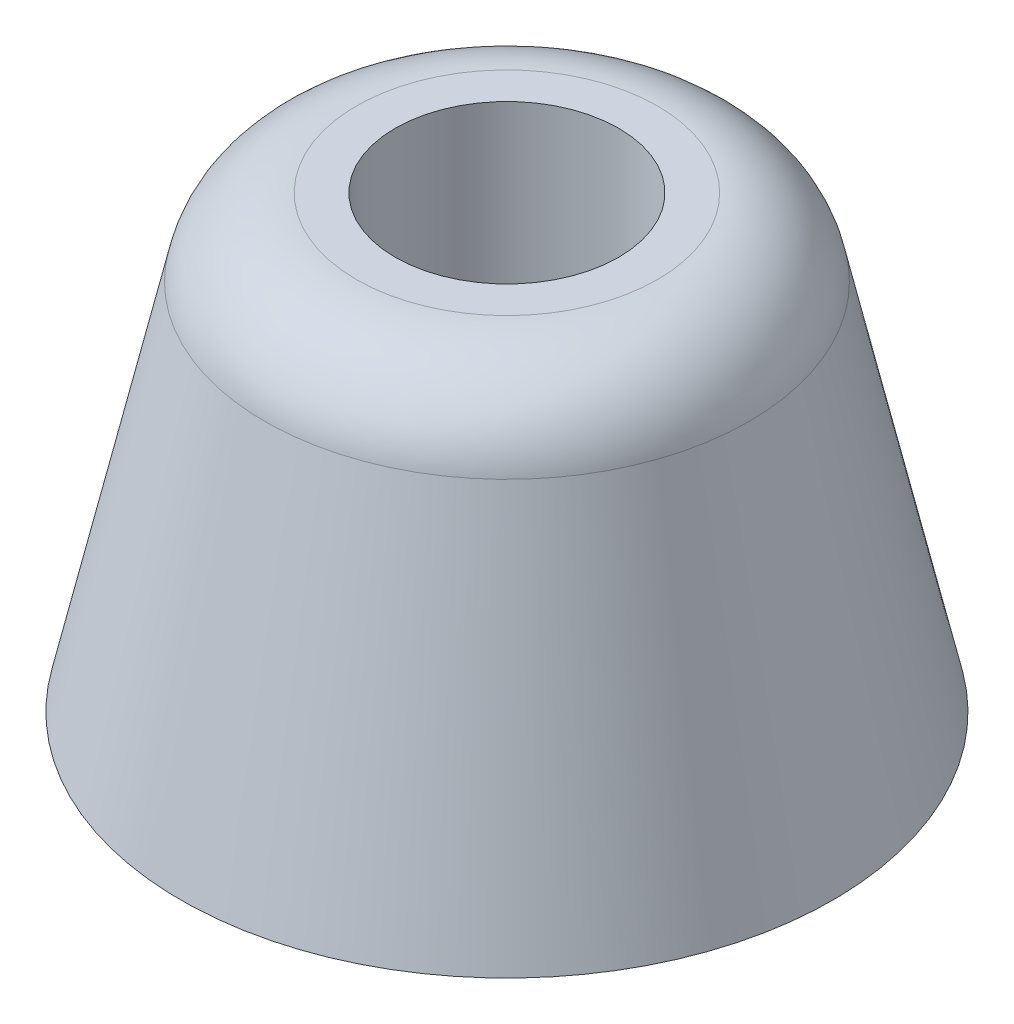
ISO-10303-21;
HEADER;
FILE_DESCRIPTION(('STEP AP214'),'2;1');
FILE_NAME('part.step','',(''),(''),'','','');
FILE_SCHEMA(('AUTOMOTIVE_DESIGN { 1 0 10303 214 1 1 1 1 }'));
ENDSEC;
DATA;
#1=APPLICATION_CONTEXT('core data for automotive mechanical design processes');
#2=APPLICATION_PROTOCOL_DEFINITION('international standard','automotive_design',2000,#1);
#3=PRODUCT_CONTEXT('',#1,'mechanical');
#4=PRODUCT('Part','Part','',(#3));
#5=PRODUCT_RELATED_PRODUCT_CATEGORY('part','',(#4));
#6=PRODUCT_DEFINITION_FORMATION('','',#4);
#7=PRODUCT_DEFINITION_CONTEXT('part definition',#1,'design');
#8=PRODUCT_DEFINITION('design','',#6,#7);
#9=PRODUCT_DEFINITION_SHAPE('','',#8);
#10=(LENGTH_UNIT() NAMED_UNIT(*) SI_UNIT(.MILLI.,.METRE.));
#11=(NAMED_UNIT(*) PLANE_ANGLE_UNIT() SI_UNIT($,.RADIAN.));
#12=(NAMED_UNIT(*) SI_UNIT($,.STERADIAN.) SOLID_ANGLE_UNIT());
#13=UNCERTAINTY_MEASURE_WITH_UNIT(LENGTH_MEASURE(1.E-05),#10,'distance_accuracy_value','');
#14=(GEOMETRIC_REPRESENTATION_CONTEXT(3) GLOBAL_UNCERTAINTY_ASSIGNED_CONTEXT((#13)) GLOBAL_UNIT_ASSIGNED_CONTEXT((#10,
#11,#12)) REPRESENTATION_CONTEXT('',''));
#15=CARTESIAN_POINT('',(0.,0.,0.));
#16=DIRECTION('',(0.,0.,1.));
#17=DIRECTION('',(1.,0.,0.));
#18=AXIS2_PLACEMENT_3D('',#15,#16,#17);
#19=CARTESIAN_POINT('',(0.,15.,0.));
#20=DIRECTION('',(0.,-1.,0.));
#21=DIRECTION('',(0.,0.,-1.));
#22=AXIS2_PLACEMENT_3D('',#19,#20,#21);
#23=PLANE('',#22);
#24=CARTESIAN_POINT('',(0.,15.,0.));
#25=DIRECTION('',(0.,1.,0.));
#26=DIRECTION('',(0.,0.,1.));
#27=AXIS2_PLACEMENT_3D('',#24,#25,#26);
#28=CIRCLE('',#27,6.);
#29=CARTESIAN_POINT('',(0.,15.,6.));
#30=VERTEX_POINT('',#29);
#31=EDGE_CURVE('E128',#30,#30,#28,.T.);
#32=ORIENTED_EDGE('',*,*,#31,.T.);
#33=EDGE_LOOP('',(#32));
#34=FACE_BOUND('',#33,.T.);
#35=CARTESIAN_POINT('',(0.,15.,0.));
#36=DIRECTION('',(0.,1.,0.));
#37=DIRECTION('',(0.,0.,1.));
#38=AXIS2_PLACEMENT_3D('',#35,#36,#37);
#39=CIRCLE('',#38,2.5);
#40=CARTESIAN_POINT('',(0.,15.,2.5));
#41=VERTEX_POINT('',#40);
#42=EDGE_CURVE('E125',#41,#41,#39,.F.);
#43=ORIENTED_EDGE('',*,*,#42,.T.);
#44=EDGE_LOOP('',(#43));
#45=FACE_BOUND('',#44,.T.);
#46=ADVANCED_FACE('F16',(#34,#45),#23,.F.);
#47=CARTESIAN_POINT('',(0.,22.5,0.));
#48=DIRECTION('',(0.,1.,0.));
#49=DIRECTION('',(0.,0.,1.));
#50=AXIS2_PLACEMENT_3D('',#47,#48,#49);
#51=CYLINDRICAL_SURFACE('',#50,6.);
#52=ORIENTED_EDGE('',*,*,#31,.F.);
#53=EDGE_LOOP('',(#52));
#54=FACE_BOUND('',#53,.T.);
#55=CARTESIAN_POINT('',(0.,24.1317591116653,0.));
#56=DIRECTION('',(0.,1.,0.));
#57=DIRECTION('',(0.,0.,1.));
#58=AXIS2_PLACEMENT_3D('',#55,#56,#57);
#59=CIRCLE('',#58,6.);
#60=CARTESIAN_POINT('',(0.,24.1317591116653,6.));
#61=VERTEX_POINT('',#60);
#62=EDGE_CURVE('E122',#61,#61,#59,.F.);
#63=ORIENTED_EDGE('',*,*,#62,.F.);
#64=EDGE_LOOP('',(#63));
#65=FACE_BOUND('',#64,.T.);
#66=ADVANCED_FACE('F98',(#54,#65),#51,.F.);
#67=CARTESIAN_POINT('',(0.,14.95,0.));
#68=DIRECTION('',(0.,1.,0.));
#69=DIRECTION('',(0.,0.,1.));
#70=AXIS2_PLACEMENT_3D('',#67,#68,#69);
#71=CYLINDRICAL_SURFACE('',#70,2.5);
#72=ORIENTED_EDGE('',*,*,#42,.F.);
#73=EDGE_LOOP('',(#72));
#74=FACE_BOUND('',#73,.T.);
#75=CARTESIAN_POINT('',(0.,0.,0.));
#76=DIRECTION('',(0.,1.,0.));
#77=DIRECTION('',(0.,0.,1.));
#78=AXIS2_PLACEMENT_3D('',#75,#76,#77);
#79=CIRCLE('',#78,2.5);
#80=CARTESIAN_POINT('',(0.,0.,2.5));
#81=VERTEX_POINT('',#80);
#82=EDGE_CURVE('E47',#81,#81,#79,.T.);
#83=ORIENTED_EDGE('',*,*,#82,.F.);
#84=EDGE_LOOP('',(#83));
#85=FACE_BOUND('',#84,.T.);
#86=ADVANCED_FACE('F87',(#74,#85),#71,.F.);
#87=CARTESIAN_POINT('',(4.03798061746948,24.1317591116653,0.));
#88=DIRECTION('',(0.,1.,0.));
#89=DIRECTION('',(0.,0.,1.));
#90=AXIS2_PLACEMENT_3D('',#87,#88,#89);
#91=PLANE('',#90);
#92=CARTESIAN_POINT('',(0.,24.1317591116653,0.));
#93=DIRECTION('',(0.,-1.,0.));
#94=DIRECTION('',(0.,0.,1.));
#95=AXIS2_PLACEMENT_3D('',#92,#93,#94);
#96=CIRCLE('',#95,8.07596123493896);
#97=CARTESIAN_POINT('',(0.,24.1317591116653,8.07596123493896));
#98=VERTEX_POINT('',#97);
#99=CARTESIAN_POINT('',(0.,24.1317591116653,-8.07596123493896));
#100=VERTEX_POINT('',#99);
#101=EDGE_CURVE('E41',#98,#100,#96,.T.);
#102=ORIENTED_EDGE('',*,*,#101,.F.);
#103=CARTESIAN_POINT('',(0.,24.1317591116653,0.));
#104=DIRECTION('',(0.,-1.,0.));
#105=DIRECTION('',(1.,0.,0.));
#106=AXIS2_PLACEMENT_3D('',#103,#104,#105);
#107=CIRCLE('',#106,8.07596123493896);
#108=CARTESIAN_POINT('',(8.07596123493896,24.1317591116653,0.));
#109=VERTEX_POINT('',#108);
#110=EDGE_CURVE('E36',#109,#98,#107,.T.);
#111=ORIENTED_EDGE('',*,*,#110,.F.);
#112=CARTESIAN_POINT('',(0.,24.1317591116653,0.));
#113=DIRECTION('',(0.,-1.,0.));
#114=DIRECTION('',(0.,0.,-1.));
#115=AXIS2_PLACEMENT_3D('',#112,#113,#114);
#116=CIRCLE('',#115,8.07596123493896);
#117=EDGE_CURVE('E45',#100,#109,#116,.T.);
#118=ORIENTED_EDGE('',*,*,#117,.F.);
#119=EDGE_LOOP('',(#102,#111,#118));
#120=FACE_BOUND('',#119,.T.);
#121=ORIENTED_EDGE('',*,*,#62,.T.);
#122=EDGE_LOOP('',(#121));
#123=FACE_BOUND('',#122,.T.);
#124=ADVANCED_FACE('F43',(#120,#123),#91,.T.);
#125=CARTESIAN_POINT('',(8.75,0.,0.));
#126=DIRECTION('',(0.,-1.,0.));
#127=DIRECTION('',(0.,0.,-1.));
#128=AXIS2_PLACEMENT_3D('',#125,#126,#127);
#129=PLANE('',#128);
#130=CARTESIAN_POINT('',(0.,0.,0.));
#131=DIRECTION('',(0.,-1.,0.));
#132=DIRECTION('',(0.,0.,-1.));
#133=AXIS2_PLACEMENT_3D('',#130,#131,#132);
#134=CIRCLE('',#133,17.5);
#135=CARTESIAN_POINT('',(0.,0.,-17.5));
#136=VERTEX_POINT('',#135);
#137=EDGE_CURVE('E27',#136,#136,#134,.F.);
#138=ORIENTED_EDGE('',*,*,#137,.F.);
#139=EDGE_LOOP('',(#138));
#140=FACE_BOUND('',#139,.T.);
#141=ORIENTED_EDGE('',*,*,#82,.T.);
#142=EDGE_LOOP('',(#141));
#143=FACE_BOUND('',#142,.T.);
#144=ADVANCED_FACE('F72',(#140,#143),#129,.T.);
#145=CARTESIAN_POINT('',(0.,19.1317591116653,0.));
#146=DIRECTION('',(0.,1.,0.));
#147=DIRECTION('',(0.,0.,1.));
#148=AXIS2_PLACEMENT_3D('',#145,#146,#147);
#149=TOROIDAL_SURFACE('',#148,8.07596123493896,5.);
#150=CARTESIAN_POINT('',(0.,20.,0.));
#151=DIRECTION('',(0.,-1.,0.));
#152=DIRECTION('',(1.,0.,0.));
#153=AXIS2_PLACEMENT_3D('',#150,#151,#152);
#154=CIRCLE('',#153,13.);
#155=CARTESIAN_POINT('',(13.,20.,0.));
#156=VERTEX_POINT('',#155);
#157=EDGE_CURVE('E10',#156,#156,#154,.T.);
#158=ORIENTED_EDGE('',*,*,#157,.F.);
#159=EDGE_LOOP('',(#158));
#160=FACE_BOUND('',#159,.T.);
#161=ORIENTED_EDGE('',*,*,#117,.T.);
#162=ORIENTED_EDGE('',*,*,#110,.T.);
#163=ORIENTED_EDGE('',*,*,#101,.T.);
#164=EDGE_LOOP('',(#161,#162,#163));
#165=FACE_BOUND('',#164,.T.);
#166=ADVANCED_FACE('F51',(#160,#165),#149,.T.);
#167=CARTESIAN_POINT('',(0.,0.,0.));
#168=DIRECTION('',(0.,-1.,0.));
#169=DIRECTION('',(0.,0.,-1.));
#170=AXIS2_PLACEMENT_3D('',#167,#168,#169);
#171=CONICAL_SURFACE('',#170,17.5,0.221314442347791);
#172=ORIENTED_EDGE('',*,*,#137,.T.);
#173=EDGE_LOOP('',(#172));
#174=FACE_BOUND('',#173,.T.);
#175=ORIENTED_EDGE('',*,*,#157,.T.);
#176=EDGE_LOOP('',(#175));
#177=FACE_BOUND('',#176,.T.);
#178=ADVANCED_FACE('F71',(#174,#177),#171,.T.);
#179=CLOSED_SHELL('',(#46,#66,#86,#124,#144,#166,#178));
#180=MANIFOLD_SOLID_BREP('B1',#179);
#181=ADVANCED_BREP_SHAPE_REPRESENTATION('',(#18,#180),#14);
#182=SHAPE_DEFINITION_REPRESENTATION(#9,#181);
ENDSEC;
END-ISO-10303-21;
